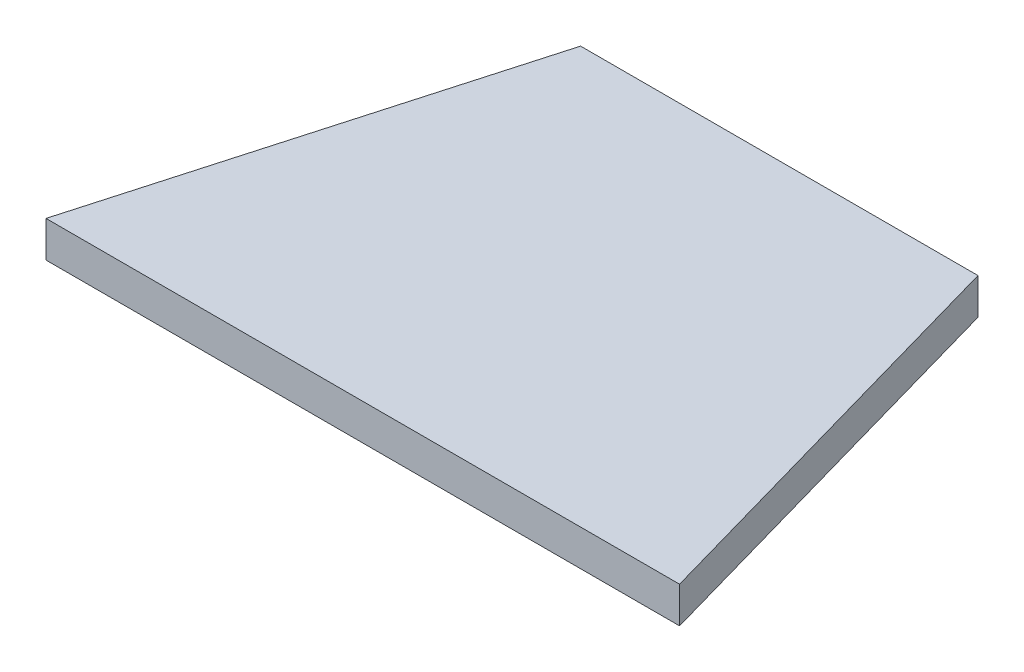
ISO-10303-21;
HEADER;
FILE_DESCRIPTION(('STEP AP214'),'2;1');
FILE_NAME('part.step','',(''),(''),'','','');
FILE_SCHEMA(('AUTOMOTIVE_DESIGN { 1 0 10303 214 1 1 1 1 }'));
ENDSEC;
DATA;
#1=APPLICATION_CONTEXT('core data for automotive mechanical design processes');
#2=APPLICATION_PROTOCOL_DEFINITION('international standard','automotive_design',2000,#1);
#3=PRODUCT_CONTEXT('',#1,'mechanical');
#4=PRODUCT('Part','Part','',(#3));
#5=PRODUCT_RELATED_PRODUCT_CATEGORY('part','',(#4));
#6=PRODUCT_DEFINITION_FORMATION('','',#4);
#7=PRODUCT_DEFINITION_CONTEXT('part definition',#1,'design');
#8=PRODUCT_DEFINITION('design','',#6,#7);
#9=PRODUCT_DEFINITION_SHAPE('','',#8);
#10=(LENGTH_UNIT() NAMED_UNIT(*) SI_UNIT(.MILLI.,.METRE.));
#11=(NAMED_UNIT(*) PLANE_ANGLE_UNIT() SI_UNIT($,.RADIAN.));
#12=(NAMED_UNIT(*) SI_UNIT($,.STERADIAN.) SOLID_ANGLE_UNIT());
#13=UNCERTAINTY_MEASURE_WITH_UNIT(LENGTH_MEASURE(1.E-05),#10,'distance_accuracy_value','');
#14=(GEOMETRIC_REPRESENTATION_CONTEXT(3) GLOBAL_UNCERTAINTY_ASSIGNED_CONTEXT((#13)) GLOBAL_UNIT_ASSIGNED_CONTEXT((#10,
#11,#12)) REPRESENTATION_CONTEXT('',''));
#15=CARTESIAN_POINT('',(0.,0.,0.));
#16=DIRECTION('',(0.,0.,1.));
#17=DIRECTION('',(1.,0.,0.));
#18=AXIS2_PLACEMENT_3D('',#15,#16,#17);
#19=CARTESIAN_POINT('',(43.8614965038278,5.,18.7179634761558));
#20=DIRECTION('',(-0.962084255282941,0.,0.272752425720963));
#21=DIRECTION('',(0.272752425720963,0.,0.962084255282941));
#22=AXIS2_PLACEMENT_3D('',#19,#20,#21);
#23=PLANE('',#22);
#24=DIRECTION('',(-0.272752425720963,0.,-0.962084255282941));
#25=VECTOR('',#24,1.);
#26=CARTESIAN_POINT('',(43.8614965038278,0.,18.7179634761558));
#27=LINE('',#26,#25);
#28=CARTESIAN_POINT('',(43.8614965038278,0.,18.7179634761558));
#29=VERTEX_POINT('',#28);
#30=CARTESIAN_POINT('',(27.5118501070472,0.,-38.9524214386906));
#31=VERTEX_POINT('',#30);
#32=EDGE_CURVE('E101',#29,#31,#27,.T.);
#33=ORIENTED_EDGE('',*,*,#32,.T.);
#34=DIRECTION('',(0.,-1.,0.));
#35=VECTOR('',#34,1.);
#36=CARTESIAN_POINT('',(27.5118501070472,5.,-38.9524214386906));
#37=LINE('',#36,#35);
#38=CARTESIAN_POINT('',(27.5118501070472,5.,-38.9524214386906));
#39=VERTEX_POINT('',#38);
#40=EDGE_CURVE('E11',#39,#31,#37,.T.);
#41=ORIENTED_EDGE('',*,*,#40,.F.);
#42=DIRECTION('',(-0.272752425720963,0.,-0.962084255282941));
#43=VECTOR('',#42,1.);
#44=CARTESIAN_POINT('',(43.8614965038278,5.,18.7179634761558));
#45=LINE('',#44,#43);
#46=CARTESIAN_POINT('',(43.8614965038278,5.,18.7179634761558));
#47=VERTEX_POINT('',#46);
#48=EDGE_CURVE('E87',#47,#39,#45,.T.);
#49=ORIENTED_EDGE('',*,*,#48,.F.);
#50=DIRECTION('',(0.,-1.,0.));
#51=VECTOR('',#50,1.);
#52=CARTESIAN_POINT('',(43.8614965038278,5.,18.7179634761558));
#53=LINE('',#52,#51);
#54=EDGE_CURVE('E97',#47,#29,#53,.T.);
#55=ORIENTED_EDGE('',*,*,#54,.T.);
#56=EDGE_LOOP('',(#33,#41,#49,#55));
#57=FACE_BOUND('',#56,.T.);
#58=ADVANCED_FACE('F37',(#57),#23,.F.);
#59=CARTESIAN_POINT('',(27.5118501070472,5.,-38.9524214386906));
#60=DIRECTION('',(0.,0.,1.));
#61=DIRECTION('',(1.,0.,0.));
#62=AXIS2_PLACEMENT_3D('',#59,#60,#61);
#63=PLANE('',#62);
#64=DIRECTION('',(-1.,0.,0.));
#65=VECTOR('',#64,1.);
#66=CARTESIAN_POINT('',(27.5118501070472,0.,-38.9524214386906));
#67=LINE('',#66,#65);
#68=CARTESIAN_POINT('',(-27.5118501070472,0.,-38.9524214386906));
#69=VERTEX_POINT('',#68);
#70=EDGE_CURVE('E92',#31,#69,#67,.T.);
#71=ORIENTED_EDGE('',*,*,#70,.T.);
#72=DIRECTION('',(0.,-1.,0.));
#73=VECTOR('',#72,1.);
#74=CARTESIAN_POINT('',(-27.5118501070472,5.,-38.9524214386906));
#75=LINE('',#74,#73);
#76=CARTESIAN_POINT('',(-27.5118501070472,5.,-38.9524214386906));
#77=VERTEX_POINT('',#76);
#78=EDGE_CURVE('E45',#77,#69,#75,.T.);
#79=ORIENTED_EDGE('',*,*,#78,.F.);
#80=DIRECTION('',(-1.,0.,0.));
#81=VECTOR('',#80,1.);
#82=CARTESIAN_POINT('',(27.5118501070472,5.,-38.9524214386906));
#83=LINE('',#82,#81);
#84=EDGE_CURVE('E81',#39,#77,#83,.T.);
#85=ORIENTED_EDGE('',*,*,#84,.F.);
#86=ORIENTED_EDGE('',*,*,#40,.T.);
#87=EDGE_LOOP('',(#71,#79,#85,#86));
#88=FACE_BOUND('',#87,.T.);
#89=ADVANCED_FACE('F91',(#88),#63,.F.);
#90=CARTESIAN_POINT('',(-27.5118501070472,5.,-38.9524214386906));
#91=DIRECTION('',(0.962084255282941,0.,0.272752425720963));
#92=DIRECTION('',(0.272752425720963,0.,-0.962084255282941));
#93=AXIS2_PLACEMENT_3D('',#90,#91,#92);
#94=PLANE('',#93);
#95=DIRECTION('',(-0.272752425720963,0.,0.96208425528294));
#96=VECTOR('',#95,1.);
#97=CARTESIAN_POINT('',(-27.5118501070472,0.,-38.9524214386906));
#98=LINE('',#97,#96);
#99=CARTESIAN_POINT('',(-43.8614965038278,0.,18.7179634761558));
#100=VERTEX_POINT('',#99);
#101=EDGE_CURVE('E105',#69,#100,#98,.T.);
#102=ORIENTED_EDGE('',*,*,#101,.T.);
#103=DIRECTION('',(0.,-1.,0.));
#104=VECTOR('',#103,1.);
#105=CARTESIAN_POINT('',(-43.8614965038278,5.,18.7179634761558));
#106=LINE('',#105,#104);
#107=CARTESIAN_POINT('',(-43.8614965038278,5.,18.7179634761558));
#108=VERTEX_POINT('',#107);
#109=EDGE_CURVE('E94',#108,#100,#106,.T.);
#110=ORIENTED_EDGE('',*,*,#109,.F.);
#111=DIRECTION('',(-0.272752425720963,0.,0.96208425528294));
#112=VECTOR('',#111,1.);
#113=CARTESIAN_POINT('',(-27.5118501070472,5.,-38.9524214386906));
#114=LINE('',#113,#112);
#115=EDGE_CURVE('E84',#77,#108,#114,.T.);
#116=ORIENTED_EDGE('',*,*,#115,.F.);
#117=ORIENTED_EDGE('',*,*,#78,.T.);
#118=EDGE_LOOP('',(#102,#110,#116,#117));
#119=FACE_BOUND('',#118,.T.);
#120=ADVANCED_FACE('F95',(#119),#94,.F.);
#121=CARTESIAN_POINT('',(11.1622037102667,5.,18.7179634761558));
#122=DIRECTION('',(0.,0.,-1.));
#123=DIRECTION('',(-1.,0.,0.));
#124=AXIS2_PLACEMENT_3D('',#121,#122,#123);
#125=PLANE('',#124);
#126=DIRECTION('',(1.,0.,0.));
#127=VECTOR('',#126,1.);
#128=CARTESIAN_POINT('',(11.1622037102667,0.,18.7179634761558));
#129=LINE('',#128,#127);
#130=EDGE_CURVE('E70',#100,#29,#129,.T.);
#131=ORIENTED_EDGE('',*,*,#130,.T.);
#132=ORIENTED_EDGE('',*,*,#54,.F.);
#133=DIRECTION('',(1.,0.,0.));
#134=VECTOR('',#133,1.);
#135=CARTESIAN_POINT('',(11.1622037102667,5.,18.7179634761558));
#136=LINE('',#135,#134);
#137=EDGE_CURVE('E53',#108,#47,#136,.T.);
#138=ORIENTED_EDGE('',*,*,#137,.F.);
#139=ORIENTED_EDGE('',*,*,#109,.T.);
#140=EDGE_LOOP('',(#131,#132,#138,#139));
#141=FACE_BOUND('',#140,.T.);
#142=ADVANCED_FACE('F109',(#141),#125,.F.);
#143=CARTESIAN_POINT('',(0.,5.,0.));
#144=DIRECTION('',(0.,1.,0.));
#145=DIRECTION('',(0.,0.,1.));
#146=AXIS2_PLACEMENT_3D('',#143,#144,#145);
#147=PLANE('',#146);
#148=ORIENTED_EDGE('',*,*,#48,.T.);
#149=ORIENTED_EDGE('',*,*,#84,.T.);
#150=ORIENTED_EDGE('',*,*,#115,.T.);
#151=ORIENTED_EDGE('',*,*,#137,.T.);
#152=EDGE_LOOP('',(#148,#149,#150,#151));
#153=FACE_BOUND('',#152,.T.);
#154=ADVANCED_FACE('F82',(#153),#147,.T.);
#155=CARTESIAN_POINT('',(0.,0.,0.));
#156=DIRECTION('',(0.,1.,0.));
#157=DIRECTION('',(0.,0.,1.));
#158=AXIS2_PLACEMENT_3D('',#155,#156,#157);
#159=PLANE('',#158);
#160=ORIENTED_EDGE('',*,*,#32,.F.);
#161=ORIENTED_EDGE('',*,*,#130,.F.);
#162=ORIENTED_EDGE('',*,*,#101,.F.);
#163=ORIENTED_EDGE('',*,*,#70,.F.);
#164=EDGE_LOOP('',(#160,#161,#162,#163));
#165=FACE_BOUND('',#164,.T.);
#166=ADVANCED_FACE('F111',(#165),#159,.F.);
#167=CLOSED_SHELL('',(#58,#89,#120,#142,#154,#166));
#168=MANIFOLD_SOLID_BREP('B2',#167);
#169=ADVANCED_BREP_SHAPE_REPRESENTATION('',(#18,#168),#14);
#170=SHAPE_DEFINITION_REPRESENTATION(#9,#169);
ENDSEC;
END-ISO-10303-21;
